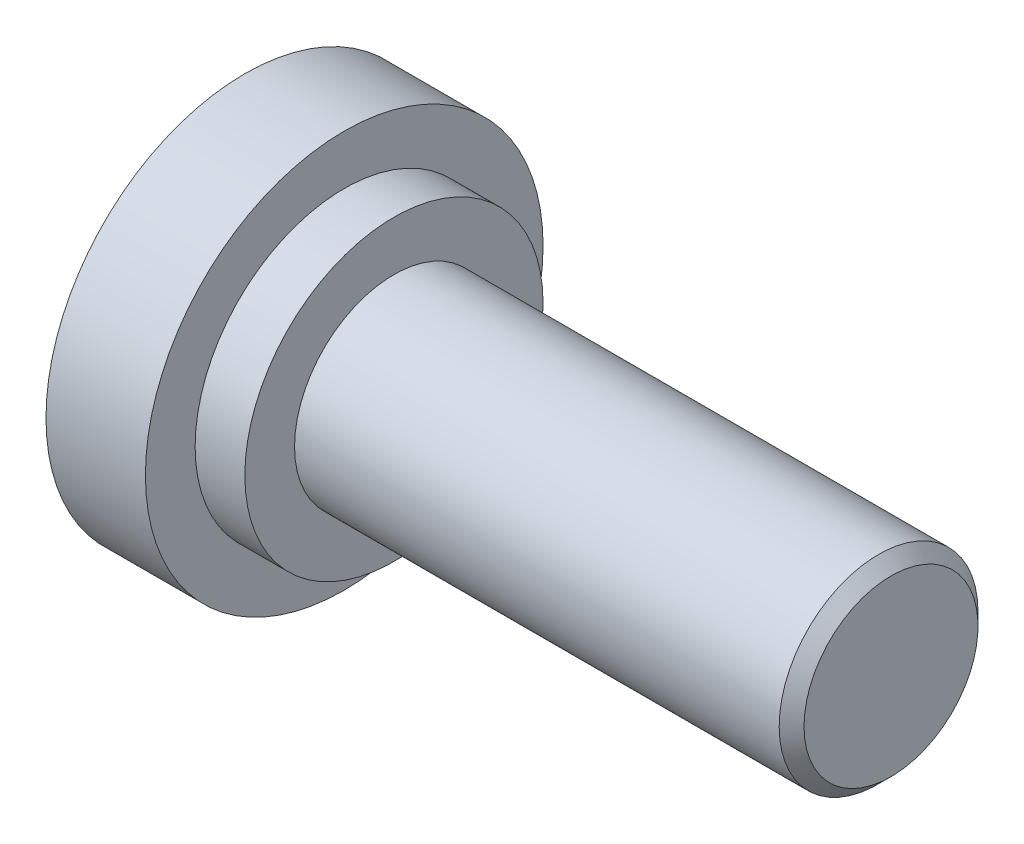
ISO-10303-21;
HEADER;
FILE_DESCRIPTION(('STEP AP214'),'2;1');
FILE_NAME('part.step','',(''),(''),'','','');
FILE_SCHEMA(('AUTOMOTIVE_DESIGN { 1 0 10303 214 1 1 1 1 }'));
ENDSEC;
DATA;
#1=APPLICATION_CONTEXT('core data for automotive mechanical design processes');
#2=APPLICATION_PROTOCOL_DEFINITION('international standard','automotive_design',2000,#1);
#3=PRODUCT_CONTEXT('',#1,'mechanical');
#4=PRODUCT('Part','Part','',(#3));
#5=PRODUCT_RELATED_PRODUCT_CATEGORY('part','',(#4));
#6=PRODUCT_DEFINITION_FORMATION('','',#4);
#7=PRODUCT_DEFINITION_CONTEXT('part definition',#1,'design');
#8=PRODUCT_DEFINITION('design','',#6,#7);
#9=PRODUCT_DEFINITION_SHAPE('','',#8);
#10=(LENGTH_UNIT() NAMED_UNIT(*) SI_UNIT(.MILLI.,.METRE.));
#11=(NAMED_UNIT(*) PLANE_ANGLE_UNIT() SI_UNIT($,.RADIAN.));
#12=(NAMED_UNIT(*) SI_UNIT($,.STERADIAN.) SOLID_ANGLE_UNIT());
#13=UNCERTAINTY_MEASURE_WITH_UNIT(LENGTH_MEASURE(1.E-05),#10,'distance_accuracy_value','');
#14=(GEOMETRIC_REPRESENTATION_CONTEXT(3) GLOBAL_UNCERTAINTY_ASSIGNED_CONTEXT((#13)) GLOBAL_UNIT_ASSIGNED_CONTEXT((#10,
#11,#12)) REPRESENTATION_CONTEXT('',''));
#15=CARTESIAN_POINT('',(0.,0.,0.));
#16=DIRECTION('',(0.,0.,1.));
#17=DIRECTION('',(1.,0.,0.));
#18=AXIS2_PLACEMENT_3D('',#15,#16,#17);
#19=CARTESIAN_POINT('',(0.,0.,0.));
#20=DIRECTION('',(1.,0.,0.));
#21=DIRECTION('',(0.,0.,-1.));
#22=AXIS2_PLACEMENT_3D('',#19,#20,#21);
#23=PLANE('',#22);
#24=CARTESIAN_POINT('',(0.,0.,0.));
#25=DIRECTION('',(-1.,0.,0.));
#26=DIRECTION('',(0.,0.,1.));
#27=AXIS2_PLACEMENT_3D('',#24,#25,#26);
#28=CIRCLE('',#27,8.);
#29=CARTESIAN_POINT('',(0.,0.,8.));
#30=VERTEX_POINT('',#29);
#31=EDGE_CURVE('E41',#30,#30,#28,.T.);
#32=ORIENTED_EDGE('',*,*,#31,.T.);
#33=EDGE_LOOP('',(#32));
#34=FACE_BOUND('',#33,.T.);
#35=ADVANCED_FACE('F31',(#34),#23,.F.);
#36=CARTESIAN_POINT('',(-4.18019429020816,0.,0.));
#37=DIRECTION('',(-1.,0.,0.));
#38=DIRECTION('',(0.,0.,1.));
#39=AXIS2_PLACEMENT_3D('',#36,#37,#38);
#40=CYLINDRICAL_SURFACE('',#39,8.);
#41=ORIENTED_EDGE('',*,*,#31,.F.);
#42=EDGE_LOOP('',(#41));
#43=FACE_BOUND('',#42,.T.);
#44=CARTESIAN_POINT('',(4.,0.,0.));
#45=DIRECTION('',(-1.,0.,0.));
#46=DIRECTION('',(0.,0.,1.));
#47=AXIS2_PLACEMENT_3D('',#44,#45,#46);
#48=CIRCLE('',#47,8.);
#49=CARTESIAN_POINT('',(4.,0.,8.));
#50=VERTEX_POINT('',#49);
#51=EDGE_CURVE('E45',#50,#50,#48,.T.);
#52=ORIENTED_EDGE('',*,*,#51,.T.);
#53=EDGE_LOOP('',(#52));
#54=FACE_BOUND('',#53,.T.);
#55=ADVANCED_FACE('F76',(#43,#54),#40,.T.);
#56=CARTESIAN_POINT('',(4.,8.,0.));
#57=DIRECTION('',(-1.,0.,0.));
#58=DIRECTION('',(0.,0.,1.));
#59=AXIS2_PLACEMENT_3D('',#56,#57,#58);
#60=PLANE('',#59);
#61=ORIENTED_EDGE('',*,*,#51,.F.);
#62=EDGE_LOOP('',(#61));
#63=FACE_BOUND('',#62,.T.);
#64=CARTESIAN_POINT('',(4.,0.,0.));
#65=DIRECTION('',(-1.,0.,0.));
#66=DIRECTION('',(0.,0.,1.));
#67=AXIS2_PLACEMENT_3D('',#64,#65,#66);
#68=CIRCLE('',#67,6.);
#69=CARTESIAN_POINT('',(4.,0.,6.));
#70=VERTEX_POINT('',#69);
#71=EDGE_CURVE('E50',#70,#70,#68,.T.);
#72=ORIENTED_EDGE('',*,*,#71,.T.);
#73=EDGE_LOOP('',(#72));
#74=FACE_BOUND('',#73,.T.);
#75=ADVANCED_FACE('F81',(#63,#74),#60,.F.);
#76=CARTESIAN_POINT('',(-4.18019429020816,0.,0.));
#77=DIRECTION('',(-1.,0.,0.));
#78=DIRECTION('',(0.,0.,1.));
#79=AXIS2_PLACEMENT_3D('',#76,#77,#78);
#80=CYLINDRICAL_SURFACE('',#79,6.);
#81=ORIENTED_EDGE('',*,*,#71,.F.);
#82=EDGE_LOOP('',(#81));
#83=FACE_BOUND('',#82,.T.);
#84=CARTESIAN_POINT('',(6.,0.,0.));
#85=DIRECTION('',(-1.,0.,0.));
#86=DIRECTION('',(0.,0.,1.));
#87=AXIS2_PLACEMENT_3D('',#84,#85,#86);
#88=CIRCLE('',#87,6.);
#89=CARTESIAN_POINT('',(6.,0.,6.));
#90=VERTEX_POINT('',#89);
#91=EDGE_CURVE('E53',#90,#90,#88,.T.);
#92=ORIENTED_EDGE('',*,*,#91,.T.);
#93=EDGE_LOOP('',(#92));
#94=FACE_BOUND('',#93,.T.);
#95=ADVANCED_FACE('F72',(#83,#94),#80,.T.);
#96=CARTESIAN_POINT('',(6.,6.,0.));
#97=DIRECTION('',(-1.,0.,0.));
#98=DIRECTION('',(0.,0.,1.));
#99=AXIS2_PLACEMENT_3D('',#96,#97,#98);
#100=PLANE('',#99);
#101=ORIENTED_EDGE('',*,*,#91,.F.);
#102=EDGE_LOOP('',(#101));
#103=FACE_BOUND('',#102,.T.);
#104=CARTESIAN_POINT('',(6.,0.,0.));
#105=DIRECTION('',(-1.,0.,0.));
#106=DIRECTION('',(0.,0.,1.));
#107=AXIS2_PLACEMENT_3D('',#104,#105,#106);
#108=CIRCLE('',#107,4.);
#109=CARTESIAN_POINT('',(6.,0.,4.));
#110=VERTEX_POINT('',#109);
#111=EDGE_CURVE('E56',#110,#110,#108,.T.);
#112=ORIENTED_EDGE('',*,*,#111,.T.);
#113=EDGE_LOOP('',(#112));
#114=FACE_BOUND('',#113,.T.);
#115=ADVANCED_FACE('F60',(#103,#114),#100,.F.);
#116=CARTESIAN_POINT('',(-4.18019429020816,0.,0.));
#117=DIRECTION('',(-1.,0.,0.));
#118=DIRECTION('',(0.,0.,1.));
#119=AXIS2_PLACEMENT_3D('',#116,#117,#118);
#120=CYLINDRICAL_SURFACE('',#119,4.);
#121=CARTESIAN_POINT('',(25.5,0.,0.));
#122=DIRECTION('',(-1.,0.,0.));
#123=DIRECTION('',(0.,0.,1.));
#124=AXIS2_PLACEMENT_3D('',#121,#122,#123);
#125=CIRCLE('',#124,4.);
#126=CARTESIAN_POINT('',(25.5,0.,4.));
#127=VERTEX_POINT('',#126);
#128=EDGE_CURVE('E37',#127,#127,#125,.T.);
#129=ORIENTED_EDGE('',*,*,#128,.T.);
#130=EDGE_LOOP('',(#129));
#131=FACE_BOUND('',#130,.T.);
#132=ORIENTED_EDGE('',*,*,#111,.F.);
#133=EDGE_LOOP('',(#132));
#134=FACE_BOUND('',#133,.T.);
#135=ADVANCED_FACE('F62',(#131,#134),#120,.T.);
#136=CARTESIAN_POINT('',(26.,4.,0.));
#137=DIRECTION('',(-1.,0.,0.));
#138=DIRECTION('',(0.,0.,1.));
#139=AXIS2_PLACEMENT_3D('',#136,#137,#138);
#140=PLANE('',#139);
#141=CARTESIAN_POINT('',(26.,0.,0.));
#142=DIRECTION('',(-1.,0.,0.));
#143=DIRECTION('',(0.,0.,1.));
#144=AXIS2_PLACEMENT_3D('',#141,#142,#143);
#145=CIRCLE('',#144,3.5);
#146=CARTESIAN_POINT('',(26.,0.,3.5));
#147=VERTEX_POINT('',#146);
#148=EDGE_CURVE('E10',#147,#147,#145,.F.);
#149=ORIENTED_EDGE('',*,*,#148,.T.);
#150=EDGE_LOOP('',(#149));
#151=FACE_BOUND('',#150,.T.);
#152=ADVANCED_FACE('F64',(#151),#140,.F.);
#153=CARTESIAN_POINT('',(25.5,0.,0.));
#154=DIRECTION('',(-1.,0.,0.));
#155=DIRECTION('',(0.,0.,1.));
#156=AXIS2_PLACEMENT_3D('',#153,#154,#155);
#157=CONICAL_SURFACE('',#156,4.,0.785398163397454);
#158=ORIENTED_EDGE('',*,*,#148,.F.);
#159=EDGE_LOOP('',(#158));
#160=FACE_BOUND('',#159,.T.);
#161=ORIENTED_EDGE('',*,*,#128,.F.);
#162=EDGE_LOOP('',(#161));
#163=FACE_BOUND('',#162,.T.);
#164=ADVANCED_FACE('F70',(#160,#163),#157,.T.);
#165=CLOSED_SHELL('',(#35,#55,#75,#95,#115,#135,#152,#164));
#166=MANIFOLD_SOLID_BREP('B2',#165);
#167=ADVANCED_BREP_SHAPE_REPRESENTATION('',(#18,#166),#14);
#168=SHAPE_DEFINITION_REPRESENTATION(#9,#167);
ENDSEC;
END-ISO-10303-21;
